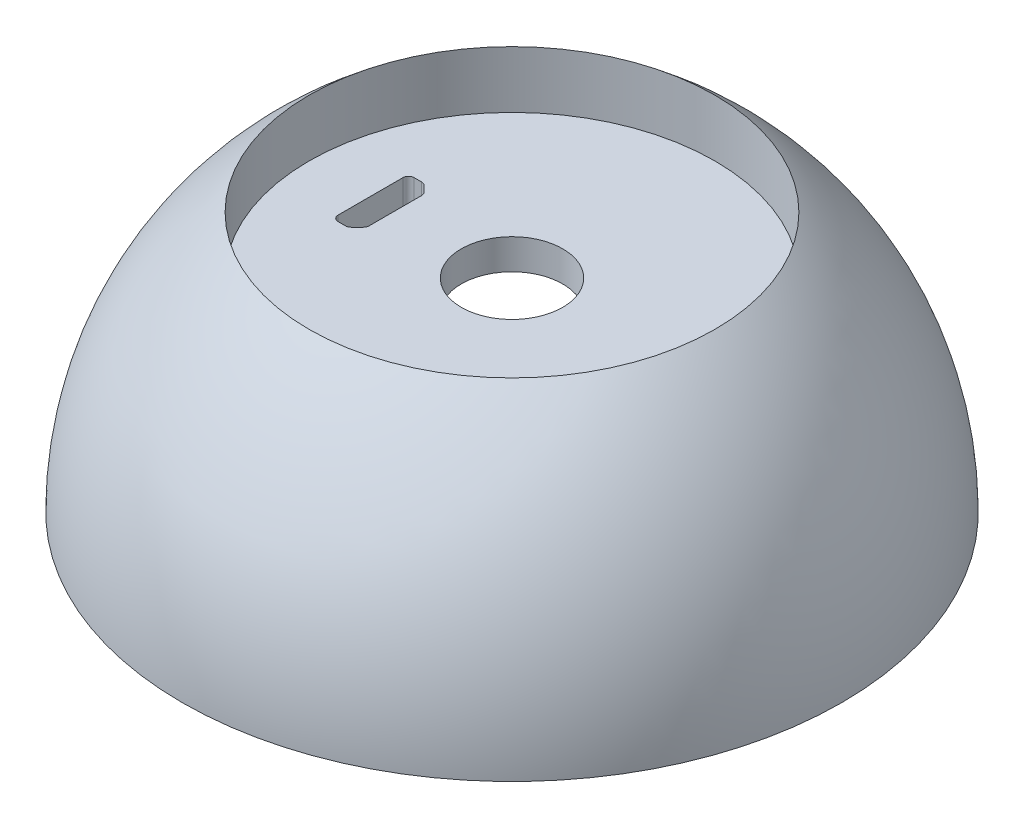
ISO-10303-21;
HEADER;
FILE_DESCRIPTION(('STEP AP214'),'2;1');
FILE_NAME('part.step','',(''),(''),'','','');
FILE_SCHEMA(('AUTOMOTIVE_DESIGN { 1 0 10303 214 1 1 1 1 }'));
ENDSEC;
DATA;
#1=APPLICATION_CONTEXT('core data for automotive mechanical design processes');
#2=APPLICATION_PROTOCOL_DEFINITION('international standard','automotive_design',2000,#1);
#3=PRODUCT_CONTEXT('',#1,'mechanical');
#4=PRODUCT('Part','Part','',(#3));
#5=PRODUCT_RELATED_PRODUCT_CATEGORY('part','',(#4));
#6=PRODUCT_DEFINITION_FORMATION('','',#4);
#7=PRODUCT_DEFINITION_CONTEXT('part definition',#1,'design');
#8=PRODUCT_DEFINITION('design','',#6,#7);
#9=PRODUCT_DEFINITION_SHAPE('','',#8);
#10=(LENGTH_UNIT() NAMED_UNIT(*) SI_UNIT(.MILLI.,.METRE.));
#11=(NAMED_UNIT(*) PLANE_ANGLE_UNIT() SI_UNIT($,.RADIAN.));
#12=(NAMED_UNIT(*) SI_UNIT($,.STERADIAN.) SOLID_ANGLE_UNIT());
#13=UNCERTAINTY_MEASURE_WITH_UNIT(LENGTH_MEASURE(1.E-05),#10,'distance_accuracy_value','');
#14=(GEOMETRIC_REPRESENTATION_CONTEXT(3) GLOBAL_UNCERTAINTY_ASSIGNED_CONTEXT((#13)) GLOBAL_UNIT_ASSIGNED_CONTEXT((#10,
#11,#12)) REPRESENTATION_CONTEXT('',''));
#15=CARTESIAN_POINT('',(0.,0.,0.));
#16=DIRECTION('',(0.,0.,1.));
#17=DIRECTION('',(1.,0.,0.));
#18=AXIS2_PLACEMENT_3D('',#15,#16,#17);
#19=CARTESIAN_POINT('',(-37.5,0.,-32.51));
#20=DIRECTION('',(0.,-1.,0.));
#21=DIRECTION('',(1.,0.,0.));
#22=AXIS2_PLACEMENT_3D('',#19,#20,#21);
#23=PLANE('',#22);
#24=CARTESIAN_POINT('',(0.,0.,0.));
#25=DIRECTION('',(0.,-1.,0.));
#26=DIRECTION('',(1.,0.,0.));
#27=AXIS2_PLACEMENT_3D('',#24,#25,#26);
#28=CIRCLE('',#27,32.5);
#29=CARTESIAN_POINT('',(32.5,0.,0.));
#30=VERTEX_POINT('',#29);
#31=EDGE_CURVE('E290',#30,#30,#28,.T.);
#32=ORIENTED_EDGE('',*,*,#31,.T.);
#33=EDGE_LOOP('',(#32));
#34=FACE_BOUND('',#33,.T.);
#35=CARTESIAN_POINT('',(0.,0.,0.));
#36=DIRECTION('',(0.,-1.,0.));
#37=DIRECTION('',(1.,0.,0.));
#38=AXIS2_PLACEMENT_3D('',#35,#36,#37);
#39=CIRCLE('',#38,29.5);
#40=CARTESIAN_POINT('',(29.5,0.,0.));
#41=VERTEX_POINT('',#40);
#42=EDGE_CURVE('E284',#41,#41,#39,.T.);
#43=ORIENTED_EDGE('',*,*,#42,.F.);
#44=EDGE_LOOP('',(#43));
#45=FACE_BOUND('',#44,.T.);
#46=ADVANCED_FACE('F42',(#34,#45),#23,.T.);
#47=CARTESIAN_POINT('',(0.,17.,0.));
#48=DIRECTION('',(0.,1.,0.));
#49=DIRECTION('',(0.,0.,1.));
#50=AXIS2_PLACEMENT_3D('',#47,#48,#49);
#51=PLANE('',#50);
#52=DIRECTION('',(0.,0.,1.));
#53=VECTOR('',#52,1.);
#54=CARTESIAN_POINT('',(-13.95,17.,1.28559272602469E-13));
#55=LINE('',#54,#53);
#56=CARTESIAN_POINT('',(-13.9500000000001,17.,-3.20036161037357));
#57=VERTEX_POINT('',#56);
#58=CARTESIAN_POINT('',(-13.95,17.,3.19963838962643));
#59=VERTEX_POINT('',#58);
#60=EDGE_CURVE('E264',#57,#59,#55,.T.);
#61=ORIENTED_EDGE('',*,*,#60,.T.);
#62=CARTESIAN_POINT('',(-13.4,17.,3.19963838962643));
#63=DIRECTION('',(0.,1.,0.));
#64=DIRECTION('',(0.,0.,1.));
#65=AXIS2_PLACEMENT_3D('',#62,#63,#64);
#66=CIRCLE('',#65,0.550000000000007);
#67=CARTESIAN_POINT('',(-13.4,17.,3.74963838962643));
#68=VERTEX_POINT('',#67);
#69=EDGE_CURVE('E268',#59,#68,#66,.T.);
#70=ORIENTED_EDGE('',*,*,#69,.T.);
#71=DIRECTION('',(1.,0.,0.));
#72=VECTOR('',#71,1.);
#73=CARTESIAN_POINT('',(0.,17.,3.74963838962643));
#74=LINE('',#73,#72);
#75=CARTESIAN_POINT('',(-12.6535533905933,17.,3.74963838962643));
#76=VERTEX_POINT('',#75);
#77=EDGE_CURVE('E199',#68,#76,#74,.T.);
#78=ORIENTED_EDGE('',*,*,#77,.T.);
#79=CARTESIAN_POINT('',(-12.6535533905933,17.,3.19963838962547));
#80=DIRECTION('',(0.,1.,0.));
#81=DIRECTION('',(0.,0.,1.));
#82=AXIS2_PLACEMENT_3D('',#79,#80,#81);
#83=CIRCLE('',#82,0.550000000000963);
#84=CARTESIAN_POINT('',(-12.2646446609407,17.,3.58854711927943));
#85=VERTEX_POINT('',#84);
#86=EDGE_CURVE('E140',#76,#85,#83,.T.);
#87=ORIENTED_EDGE('',*,*,#86,.T.);
#88=DIRECTION('',(0.707106781186548,0.,-0.707106781186548));
#89=VECTOR('',#88,1.);
#90=CARTESIAN_POINT('',(-4.33804877083063,17.,-4.33804877083063));
#91=LINE('',#90,#89);
#92=CARTESIAN_POINT('',(-11.6610912703473,17.,2.98499372868608));
#93=VERTEX_POINT('',#92);
#94=EDGE_CURVE('E232',#85,#93,#91,.T.);
#95=ORIENTED_EDGE('',*,*,#94,.T.);
#96=CARTESIAN_POINT('',(-12.0500000000002,17.,2.59608499903343));
#97=DIRECTION('',(0.,1.,0.));
#98=DIRECTION('',(0.,0.,1.));
#99=AXIS2_PLACEMENT_3D('',#96,#97,#98);
#100=CIRCLE('',#99,0.550000000000234);
#101=CARTESIAN_POINT('',(-11.5,17.,2.59608499903343));
#102=VERTEX_POINT('',#101);
#103=EDGE_CURVE('E236',#93,#102,#100,.T.);
#104=ORIENTED_EDGE('',*,*,#103,.T.);
#105=DIRECTION('',(0.,0.,-1.));
#106=VECTOR('',#105,1.);
#107=CARTESIAN_POINT('',(-11.5,17.,0.));
#108=LINE('',#107,#106);
#109=CARTESIAN_POINT('',(-11.5,17.,-2.59680821977997));
#110=VERTEX_POINT('',#109);
#111=EDGE_CURVE('E240',#102,#110,#108,.T.);
#112=ORIENTED_EDGE('',*,*,#111,.T.);
#113=CARTESIAN_POINT('',(-12.0499999999986,17.,-2.59680821978093));
#114=DIRECTION('',(0.,1.,0.));
#115=DIRECTION('',(0.,0.,1.));
#116=AXIS2_PLACEMENT_3D('',#113,#114,#115);
#117=CIRCLE('',#116,0.549999999998642);
#118=CARTESIAN_POINT('',(-11.661091270347,17.,-2.98571694943257));
#119=VERTEX_POINT('',#118);
#120=EDGE_CURVE('E244',#110,#119,#117,.T.);
#121=ORIENTED_EDGE('',*,*,#120,.T.);
#122=DIRECTION('',(-0.707106781186547,0.,-0.707106781186548));
#123=VECTOR('',#122,1.);
#124=CARTESIAN_POINT('',(-4.33768716045722,17.,4.33768716045722));
#125=LINE('',#124,#123);
#126=CARTESIAN_POINT('',(-12.2646446609406,17.,-3.58927034002617));
#127=VERTEX_POINT('',#126);
#128=EDGE_CURVE('E248',#119,#127,#125,.T.);
#129=ORIENTED_EDGE('',*,*,#128,.T.);
#130=CARTESIAN_POINT('',(-12.6535533905932,17.,-3.20036161037357));
#131=DIRECTION('',(0.,1.,0.));
#132=DIRECTION('',(0.,0.,1.));
#133=AXIS2_PLACEMENT_3D('',#130,#131,#132);
#134=CIRCLE('',#133,0.549999999999999);
#135=CARTESIAN_POINT('',(-12.6535533905932,17.,-3.75036161037357));
#136=VERTEX_POINT('',#135);
#137=EDGE_CURVE('E252',#127,#136,#134,.T.);
#138=ORIENTED_EDGE('',*,*,#137,.T.);
#139=DIRECTION('',(-1.,0.,0.));
#140=VECTOR('',#139,1.);
#141=CARTESIAN_POINT('',(1.45988774195049E-13,17.,-3.75036161037308));
#142=LINE('',#141,#140);
#143=CARTESIAN_POINT('',(-13.4,17.,-3.7503616103736));
#144=VERTEX_POINT('',#143);
#145=EDGE_CURVE('E256',#136,#144,#142,.T.);
#146=ORIENTED_EDGE('',*,*,#145,.T.);
#147=CARTESIAN_POINT('',(-13.4000000000001,17.,-3.20036161037357));
#148=DIRECTION('',(0.,1.,0.));
#149=DIRECTION('',(0.,0.,1.));
#150=AXIS2_PLACEMENT_3D('',#147,#148,#149);
#151=CIRCLE('',#150,0.549999999999957);
#152=EDGE_CURVE('E260',#144,#57,#151,.T.);
#153=ORIENTED_EDGE('',*,*,#152,.T.);
#154=EDGE_LOOP('',(#61,#70,#78,#87,#95,#104,#112,#121,#129,#138,#146,#153));
#155=FACE_BOUND('',#154,.T.);
#156=CARTESIAN_POINT('',(0.,17.,0.));
#157=DIRECTION('',(0.,1.,0.));
#158=DIRECTION('',(0.,0.,1.));
#159=AXIS2_PLACEMENT_3D('',#156,#157,#158);
#160=CIRCLE('',#159,5.);
#161=CARTESIAN_POINT('',(0.,17.,5.));
#162=VERTEX_POINT('',#161);
#163=EDGE_CURVE('E46',#162,#162,#160,.T.);
#164=ORIENTED_EDGE('',*,*,#163,.T.);
#165=EDGE_LOOP('',(#164));
#166=FACE_BOUND('',#165,.T.);
#167=CARTESIAN_POINT('',(0.,17.,0.));
#168=DIRECTION('',(0.,1.,0.));
#169=DIRECTION('',(0.,0.,1.));
#170=AXIS2_PLACEMENT_3D('',#167,#168,#169);
#171=CIRCLE('',#170,23.);
#172=CARTESIAN_POINT('',(0.,17.,23.));
#173=VERTEX_POINT('',#172);
#174=EDGE_CURVE('E280',#173,#173,#171,.T.);
#175=ORIENTED_EDGE('',*,*,#174,.F.);
#176=EDGE_LOOP('',(#175));
#177=FACE_BOUND('',#176,.T.);
#178=ADVANCED_FACE('F299',(#155,#166,#177),#51,.F.);
#179=CARTESIAN_POINT('',(0.,20.,0.));
#180=DIRECTION('',(0.,1.,0.));
#181=DIRECTION('',(0.,0.,1.));
#182=AXIS2_PLACEMENT_3D('',#179,#180,#181);
#183=CYLINDRICAL_SURFACE('',#182,23.);
#184=ORIENTED_EDGE('',*,*,#174,.T.);
#185=EDGE_LOOP('',(#184));
#186=FACE_BOUND('',#185,.T.);
#187=CARTESIAN_POINT('',(0.,18.4729532019112,0.));
#188=DIRECTION('',(0.,-1.,0.));
#189=DIRECTION('',(0.,0.,-1.));
#190=AXIS2_PLACEMENT_3D('',#187,#188,#189);
#191=CIRCLE('',#190,23.);
#192=CARTESIAN_POINT('',(0.,18.4729532019112,-23.));
#193=VERTEX_POINT('',#192);
#194=EDGE_CURVE('E276',#193,#193,#191,.T.);
#195=ORIENTED_EDGE('',*,*,#194,.T.);
#196=EDGE_LOOP('',(#195));
#197=FACE_BOUND('',#196,.T.);
#198=ADVANCED_FACE('F321',(#186,#197),#183,.T.);
#199=CARTESIAN_POINT('',(0.,0.,0.));
#200=DIRECTION('',(0.,-1.,0.));
#201=DIRECTION('',(1.,0.,0.));
#202=AXIS2_PLACEMENT_3D('',#199,#200,#201);
#203=SPHERICAL_SURFACE('',#202,29.5);
#204=ORIENTED_EDGE('',*,*,#194,.F.);
#205=EDGE_LOOP('',(#204));
#206=FACE_BOUND('',#205,.T.);
#207=ORIENTED_EDGE('',*,*,#42,.T.);
#208=EDGE_LOOP('',(#207));
#209=FACE_BOUND('',#208,.T.);
#210=ADVANCED_FACE('F326',(#206,#209),#203,.F.);
#211=CARTESIAN_POINT('',(0.,0.,0.));
#212=DIRECTION('',(0.,-1.,0.));
#213=DIRECTION('',(1.,0.,0.));
#214=AXIS2_PLACEMENT_3D('',#211,#212,#213);
#215=SPHERICAL_SURFACE('',#214,32.5);
#216=CARTESIAN_POINT('',(0.,25.617376914899,0.));
#217=DIRECTION('',(0.,-1.,0.));
#218=DIRECTION('',(0.,0.,-1.));
#219=AXIS2_PLACEMENT_3D('',#216,#217,#218);
#220=CIRCLE('',#219,20.);
#221=CARTESIAN_POINT('',(0.,25.617376914899,-20.));
#222=VERTEX_POINT('',#221);
#223=EDGE_CURVE('E52',#222,#222,#220,.T.);
#224=ORIENTED_EDGE('',*,*,#223,.T.);
#225=EDGE_LOOP('',(#224));
#226=FACE_BOUND('',#225,.T.);
#227=ORIENTED_EDGE('',*,*,#31,.F.);
#228=EDGE_LOOP('',(#227));
#229=FACE_BOUND('',#228,.T.);
#230=ADVANCED_FACE('F44',(#226,#229),#215,.T.);
#231=CARTESIAN_POINT('',(0.,20.,0.));
#232=DIRECTION('',(0.,1.,0.));
#233=DIRECTION('',(0.,0.,1.));
#234=AXIS2_PLACEMENT_3D('',#231,#232,#233);
#235=CYLINDRICAL_SURFACE('',#234,20.);
#236=CARTESIAN_POINT('',(0.,20.,0.));
#237=DIRECTION('',(0.,1.,0.));
#238=DIRECTION('',(0.,0.,1.));
#239=AXIS2_PLACEMENT_3D('',#236,#237,#238);
#240=CIRCLE('',#239,20.);
#241=CARTESIAN_POINT('',(0.,20.,20.));
#242=VERTEX_POINT('',#241);
#243=EDGE_CURVE('E11',#242,#242,#240,.T.);
#244=ORIENTED_EDGE('',*,*,#243,.F.);
#245=EDGE_LOOP('',(#244));
#246=FACE_BOUND('',#245,.T.);
#247=ORIENTED_EDGE('',*,*,#223,.F.);
#248=EDGE_LOOP('',(#247));
#249=FACE_BOUND('',#248,.T.);
#250=ADVANCED_FACE('F314',(#246,#249),#235,.F.);
#251=CARTESIAN_POINT('',(0.,20.,0.));
#252=DIRECTION('',(0.,1.,0.));
#253=DIRECTION('',(0.,0.,1.));
#254=AXIS2_PLACEMENT_3D('',#251,#252,#253);
#255=PLANE('',#254);
#256=CARTESIAN_POINT('',(-13.4,20.,3.19963838962643));
#257=DIRECTION('',(0.,1.,0.));
#258=DIRECTION('',(0.,0.,1.));
#259=AXIS2_PLACEMENT_3D('',#256,#257,#258);
#260=CIRCLE('',#259,0.550000000000007);
#261=CARTESIAN_POINT('',(-13.95,20.,3.19963838962643));
#262=VERTEX_POINT('',#261);
#263=CARTESIAN_POINT('',(-13.4,20.,3.74963838962643));
#264=VERTEX_POINT('',#263);
#265=EDGE_CURVE('E68',#262,#264,#260,.T.);
#266=ORIENTED_EDGE('',*,*,#265,.F.);
#267=DIRECTION('',(0.,0.,1.));
#268=VECTOR('',#267,1.);
#269=CARTESIAN_POINT('',(-13.9500000000001,20.,-3.20036161037357));
#270=LINE('',#269,#268);
#271=CARTESIAN_POINT('',(-13.9500000000001,20.,-3.20036161037357));
#272=VERTEX_POINT('',#271);
#273=EDGE_CURVE('E190',#272,#262,#270,.T.);
#274=ORIENTED_EDGE('',*,*,#273,.F.);
#275=CARTESIAN_POINT('',(-13.4000000000001,20.,-3.20036161037357));
#276=DIRECTION('',(0.,1.,0.));
#277=DIRECTION('',(0.,0.,1.));
#278=AXIS2_PLACEMENT_3D('',#275,#276,#277);
#279=CIRCLE('',#278,0.549999999999957);
#280=CARTESIAN_POINT('',(-13.4,20.,-3.7503616103736));
#281=VERTEX_POINT('',#280);
#282=EDGE_CURVE('E186',#281,#272,#279,.T.);
#283=ORIENTED_EDGE('',*,*,#282,.F.);
#284=DIRECTION('',(-1.,0.,0.));
#285=VECTOR('',#284,1.);
#286=CARTESIAN_POINT('',(-12.6535533905932,20.,-3.75036161037357));
#287=LINE('',#286,#285);
#288=CARTESIAN_POINT('',(-12.6535533905932,20.,-3.75036161037357));
#289=VERTEX_POINT('',#288);
#290=EDGE_CURVE('E182',#289,#281,#287,.T.);
#291=ORIENTED_EDGE('',*,*,#290,.F.);
#292=CARTESIAN_POINT('',(-12.6535533905932,20.,-3.20036161037357));
#293=DIRECTION('',(0.,1.,0.));
#294=DIRECTION('',(0.,0.,1.));
#295=AXIS2_PLACEMENT_3D('',#292,#293,#294);
#296=CIRCLE('',#295,0.549999999999999);
#297=CARTESIAN_POINT('',(-12.2646446609406,20.,-3.58927034002617));
#298=VERTEX_POINT('',#297);
#299=EDGE_CURVE('E178',#298,#289,#296,.T.);
#300=ORIENTED_EDGE('',*,*,#299,.F.);
#301=DIRECTION('',(-0.707106781186547,0.,-0.707106781186548));
#302=VECTOR('',#301,1.);
#303=CARTESIAN_POINT('',(-11.661091270347,20.,-2.98571694943257));
#304=LINE('',#303,#302);
#305=CARTESIAN_POINT('',(-11.661091270347,20.,-2.98571694943257));
#306=VERTEX_POINT('',#305);
#307=EDGE_CURVE('E174',#306,#298,#304,.T.);
#308=ORIENTED_EDGE('',*,*,#307,.F.);
#309=CARTESIAN_POINT('',(-12.0499999999986,20.,-2.59680821978093));
#310=DIRECTION('',(0.,1.,0.));
#311=DIRECTION('',(0.,0.,1.));
#312=AXIS2_PLACEMENT_3D('',#309,#310,#311);
#313=CIRCLE('',#312,0.549999999998642);
#314=CARTESIAN_POINT('',(-11.5,20.,-2.59680821977997));
#315=VERTEX_POINT('',#314);
#316=EDGE_CURVE('E170',#315,#306,#313,.T.);
#317=ORIENTED_EDGE('',*,*,#316,.F.);
#318=DIRECTION('',(0.,0.,-1.));
#319=VECTOR('',#318,1.);
#320=CARTESIAN_POINT('',(-11.5,20.,-2.50036161037357));
#321=LINE('',#320,#319);
#322=CARTESIAN_POINT('',(-11.5,20.,2.59608499903343));
#323=VERTEX_POINT('',#322);
#324=EDGE_CURVE('E166',#323,#315,#321,.T.);
#325=ORIENTED_EDGE('',*,*,#324,.F.);
#326=CARTESIAN_POINT('',(-12.0500000000002,20.,2.59608499903343));
#327=DIRECTION('',(0.,1.,0.));
#328=DIRECTION('',(0.,0.,1.));
#329=AXIS2_PLACEMENT_3D('',#326,#327,#328);
#330=CIRCLE('',#329,0.550000000000234);
#331=CARTESIAN_POINT('',(-11.6610912703473,20.,2.98499372868608));
#332=VERTEX_POINT('',#331);
#333=EDGE_CURVE('E160',#332,#323,#330,.T.);
#334=ORIENTED_EDGE('',*,*,#333,.F.);
#335=DIRECTION('',(0.707106781186548,0.,-0.707106781186548));
#336=VECTOR('',#335,1.);
#337=CARTESIAN_POINT('',(-12.2646446609407,20.,3.58854711927943));
#338=LINE('',#337,#336);
#339=CARTESIAN_POINT('',(-12.2646446609407,20.,3.58854711927943));
#340=VERTEX_POINT('',#339);
#341=EDGE_CURVE('E156',#340,#332,#338,.T.);
#342=ORIENTED_EDGE('',*,*,#341,.F.);
#343=CARTESIAN_POINT('',(-12.6535533905933,20.,3.19963838962547));
#344=DIRECTION('',(0.,1.,0.));
#345=DIRECTION('',(0.,0.,1.));
#346=AXIS2_PLACEMENT_3D('',#343,#344,#345);
#347=CIRCLE('',#346,0.550000000000963);
#348=CARTESIAN_POINT('',(-12.6535533905933,20.,3.74963838962643));
#349=VERTEX_POINT('',#348);
#350=EDGE_CURVE('E137',#349,#340,#347,.T.);
#351=ORIENTED_EDGE('',*,*,#350,.F.);
#352=DIRECTION('',(1.,0.,0.));
#353=VECTOR('',#352,1.);
#354=CARTESIAN_POINT('',(-13.4,20.,3.74963838962643));
#355=LINE('',#354,#353);
#356=EDGE_CURVE('E147',#264,#349,#355,.T.);
#357=ORIENTED_EDGE('',*,*,#356,.F.);
#358=EDGE_LOOP('',(#266,#274,#283,#291,#300,#308,#317,#325,#334,#342,#351,#357));
#359=FACE_BOUND('',#358,.T.);
#360=CARTESIAN_POINT('',(0.,20.,0.));
#361=DIRECTION('',(0.,1.,0.));
#362=DIRECTION('',(0.,0.,1.));
#363=AXIS2_PLACEMENT_3D('',#360,#361,#362);
#364=CIRCLE('',#363,5.);
#365=CARTESIAN_POINT('',(0.,20.,5.));
#366=VERTEX_POINT('',#365);
#367=EDGE_CURVE('E272',#366,#366,#364,.T.);
#368=ORIENTED_EDGE('',*,*,#367,.F.);
#369=EDGE_LOOP('',(#368));
#370=FACE_BOUND('',#369,.T.);
#371=ORIENTED_EDGE('',*,*,#243,.T.);
#372=EDGE_LOOP('',(#371));
#373=FACE_BOUND('',#372,.T.);
#374=ADVANCED_FACE('F152',(#359,#370,#373),#255,.T.);
#375=CARTESIAN_POINT('',(0.,7.5,0.));
#376=DIRECTION('',(0.,1.,0.));
#377=DIRECTION('',(0.,0.,1.));
#378=AXIS2_PLACEMENT_3D('',#375,#376,#377);
#379=CYLINDRICAL_SURFACE('',#378,5.);
#380=ORIENTED_EDGE('',*,*,#367,.T.);
#381=EDGE_LOOP('',(#380));
#382=FACE_BOUND('',#381,.T.);
#383=ORIENTED_EDGE('',*,*,#163,.F.);
#384=EDGE_LOOP('',(#383));
#385=FACE_BOUND('',#384,.T.);
#386=ADVANCED_FACE('F302',(#382,#385),#379,.F.);
#387=CARTESIAN_POINT('',(-13.4,10.,3.19963838962643));
#388=DIRECTION('',(0.,1.,0.));
#389=DIRECTION('',(0.,0.,1.));
#390=AXIS2_PLACEMENT_3D('',#387,#388,#389);
#391=CYLINDRICAL_SURFACE('',#390,0.550000000000007);
#392=DIRECTION('',(0.,1.,0.));
#393=VECTOR('',#392,1.);
#394=CARTESIAN_POINT('',(-13.95,10.,3.19963838962643));
#395=LINE('',#394,#393);
#396=EDGE_CURVE('E196',#59,#262,#395,.T.);
#397=ORIENTED_EDGE('',*,*,#396,.T.);
#398=ORIENTED_EDGE('',*,*,#265,.T.);
#399=DIRECTION('',(0.,1.,0.));
#400=VECTOR('',#399,1.);
#401=CARTESIAN_POINT('',(-13.4,10.,3.74963838962643));
#402=LINE('',#401,#400);
#403=EDGE_CURVE('E144',#68,#264,#402,.T.);
#404=ORIENTED_EDGE('',*,*,#403,.F.);
#405=ORIENTED_EDGE('',*,*,#69,.F.);
#406=EDGE_LOOP('',(#397,#398,#404,#405));
#407=FACE_BOUND('',#406,.T.);
#408=ADVANCED_FACE('F304',(#407),#391,.F.);
#409=CARTESIAN_POINT('',(-13.9500000000001,10.,-3.20036161037357));
#410=DIRECTION('',(-1.,0.,0.));
#411=DIRECTION('',(0.,0.,1.));
#412=AXIS2_PLACEMENT_3D('',#409,#410,#411);
#413=PLANE('',#412);
#414=DIRECTION('',(0.,1.,0.));
#415=VECTOR('',#414,1.);
#416=CARTESIAN_POINT('',(-13.9500000000001,10.,-3.20036161037357));
#417=LINE('',#416,#415);
#418=EDGE_CURVE('E200',#57,#272,#417,.T.);
#419=ORIENTED_EDGE('',*,*,#418,.T.);
#420=ORIENTED_EDGE('',*,*,#273,.T.);
#421=ORIENTED_EDGE('',*,*,#396,.F.);
#422=ORIENTED_EDGE('',*,*,#60,.F.);
#423=EDGE_LOOP('',(#419,#420,#421,#422));
#424=FACE_BOUND('',#423,.T.);
#425=ADVANCED_FACE('F311',(#424),#413,.F.);
#426=CARTESIAN_POINT('',(-13.4000000000001,10.,-3.20036161037357));
#427=DIRECTION('',(0.,1.,0.));
#428=DIRECTION('',(0.,0.,1.));
#429=AXIS2_PLACEMENT_3D('',#426,#427,#428);
#430=CYLINDRICAL_SURFACE('',#429,0.549999999999957);
#431=DIRECTION('',(0.,1.,0.));
#432=VECTOR('',#431,1.);
#433=CARTESIAN_POINT('',(-13.4,10.,-3.7503616103736));
#434=LINE('',#433,#432);
#435=EDGE_CURVE('E203',#144,#281,#434,.T.);
#436=ORIENTED_EDGE('',*,*,#435,.T.);
#437=ORIENTED_EDGE('',*,*,#282,.T.);
#438=ORIENTED_EDGE('',*,*,#418,.F.);
#439=ORIENTED_EDGE('',*,*,#152,.F.);
#440=EDGE_LOOP('',(#436,#437,#438,#439));
#441=FACE_BOUND('',#440,.T.);
#442=ADVANCED_FACE('F372',(#441),#430,.F.);
#443=CARTESIAN_POINT('',(-12.6535533905932,10.,-3.75036161037357));
#444=DIRECTION('',(0.,0.,-1.));
#445=DIRECTION('',(-1.,0.,0.));
#446=AXIS2_PLACEMENT_3D('',#443,#444,#445);
#447=PLANE('',#446);
#448=DIRECTION('',(0.,1.,0.));
#449=VECTOR('',#448,1.);
#450=CARTESIAN_POINT('',(-12.6535533905932,10.,-3.75036161037357));
#451=LINE('',#450,#449);
#452=EDGE_CURVE('E206',#136,#289,#451,.T.);
#453=ORIENTED_EDGE('',*,*,#452,.T.);
#454=ORIENTED_EDGE('',*,*,#290,.T.);
#455=ORIENTED_EDGE('',*,*,#435,.F.);
#456=ORIENTED_EDGE('',*,*,#145,.F.);
#457=EDGE_LOOP('',(#453,#454,#455,#456));
#458=FACE_BOUND('',#457,.T.);
#459=ADVANCED_FACE('F383',(#458),#447,.F.);
#460=CARTESIAN_POINT('',(-12.6535533905932,10.,-3.20036161037357));
#461=DIRECTION('',(0.,1.,0.));
#462=DIRECTION('',(0.,0.,1.));
#463=AXIS2_PLACEMENT_3D('',#460,#461,#462);
#464=CYLINDRICAL_SURFACE('',#463,0.549999999999999);
#465=DIRECTION('',(0.,1.,0.));
#466=VECTOR('',#465,1.);
#467=CARTESIAN_POINT('',(-12.2646446609406,10.,-3.58927034002617));
#468=LINE('',#467,#466);
#469=EDGE_CURVE('E209',#127,#298,#468,.T.);
#470=ORIENTED_EDGE('',*,*,#469,.T.);
#471=ORIENTED_EDGE('',*,*,#299,.T.);
#472=ORIENTED_EDGE('',*,*,#452,.F.);
#473=ORIENTED_EDGE('',*,*,#137,.F.);
#474=EDGE_LOOP('',(#470,#471,#472,#473));
#475=FACE_BOUND('',#474,.T.);
#476=ADVANCED_FACE('F393',(#475),#464,.F.);
#477=CARTESIAN_POINT('',(-11.661091270347,10.,-2.98571694943257));
#478=DIRECTION('',(0.707106781186548,0.,-0.707106781186547));
#479=DIRECTION('',(-0.707106781186547,0.,-0.707106781186548));
#480=AXIS2_PLACEMENT_3D('',#477,#478,#479);
#481=PLANE('',#480);
#482=DIRECTION('',(0.,1.,0.));
#483=VECTOR('',#482,1.);
#484=CARTESIAN_POINT('',(-11.661091270347,10.,-2.98571694943257));
#485=LINE('',#484,#483);
#486=EDGE_CURVE('E212',#119,#306,#485,.T.);
#487=ORIENTED_EDGE('',*,*,#486,.T.);
#488=ORIENTED_EDGE('',*,*,#307,.T.);
#489=ORIENTED_EDGE('',*,*,#469,.F.);
#490=ORIENTED_EDGE('',*,*,#128,.F.);
#491=EDGE_LOOP('',(#487,#488,#489,#490));
#492=FACE_BOUND('',#491,.T.);
#493=ADVANCED_FACE('F403',(#492),#481,.F.);
#494=CARTESIAN_POINT('',(-12.0499999999986,10.,-2.59680821978093));
#495=DIRECTION('',(0.,1.,0.));
#496=DIRECTION('',(0.,0.,1.));
#497=AXIS2_PLACEMENT_3D('',#494,#495,#496);
#498=CYLINDRICAL_SURFACE('',#497,0.549999999998642);
#499=DIRECTION('',(0.,1.,0.));
#500=VECTOR('',#499,1.);
#501=CARTESIAN_POINT('',(-11.5,10.,-2.59680821977997));
#502=LINE('',#501,#500);
#503=EDGE_CURVE('E215',#110,#315,#502,.T.);
#504=ORIENTED_EDGE('',*,*,#503,.T.);
#505=ORIENTED_EDGE('',*,*,#316,.T.);
#506=ORIENTED_EDGE('',*,*,#486,.F.);
#507=ORIENTED_EDGE('',*,*,#120,.F.);
#508=EDGE_LOOP('',(#504,#505,#506,#507));
#509=FACE_BOUND('',#508,.T.);
#510=ADVANCED_FACE('F413',(#509),#498,.F.);
#511=CARTESIAN_POINT('',(-11.5,10.,-2.50036161037357));
#512=DIRECTION('',(1.,0.,0.));
#513=DIRECTION('',(0.,0.,-1.));
#514=AXIS2_PLACEMENT_3D('',#511,#512,#513);
#515=PLANE('',#514);
#516=DIRECTION('',(0.,1.,0.));
#517=VECTOR('',#516,1.);
#518=CARTESIAN_POINT('',(-11.5,10.,2.59608499903343));
#519=LINE('',#518,#517);
#520=EDGE_CURVE('E218',#102,#323,#519,.T.);
#521=ORIENTED_EDGE('',*,*,#520,.T.);
#522=ORIENTED_EDGE('',*,*,#324,.T.);
#523=ORIENTED_EDGE('',*,*,#503,.F.);
#524=ORIENTED_EDGE('',*,*,#111,.F.);
#525=EDGE_LOOP('',(#521,#522,#523,#524));
#526=FACE_BOUND('',#525,.T.);
#527=ADVANCED_FACE('F423',(#526),#515,.F.);
#528=CARTESIAN_POINT('',(-12.0500000000002,10.,2.59608499903343));
#529=DIRECTION('',(0.,1.,0.));
#530=DIRECTION('',(0.,0.,1.));
#531=AXIS2_PLACEMENT_3D('',#528,#529,#530);
#532=CYLINDRICAL_SURFACE('',#531,0.550000000000234);
#533=DIRECTION('',(0.,1.,0.));
#534=VECTOR('',#533,1.);
#535=CARTESIAN_POINT('',(-11.6610912703473,10.,2.98499372868608));
#536=LINE('',#535,#534);
#537=EDGE_CURVE('E221',#93,#332,#536,.T.);
#538=ORIENTED_EDGE('',*,*,#537,.T.);
#539=ORIENTED_EDGE('',*,*,#333,.T.);
#540=ORIENTED_EDGE('',*,*,#520,.F.);
#541=ORIENTED_EDGE('',*,*,#103,.F.);
#542=EDGE_LOOP('',(#538,#539,#540,#541));
#543=FACE_BOUND('',#542,.T.);
#544=ADVANCED_FACE('F434',(#543),#532,.F.);
#545=CARTESIAN_POINT('',(-12.2646446609407,10.,3.58854711927943));
#546=DIRECTION('',(0.707106781186548,0.,0.707106781186548));
#547=DIRECTION('',(0.707106781186548,0.,-0.707106781186548));
#548=AXIS2_PLACEMENT_3D('',#545,#546,#547);
#549=PLANE('',#548);
#550=DIRECTION('',(0.,1.,0.));
#551=VECTOR('',#550,1.);
#552=CARTESIAN_POINT('',(-12.2646446609407,10.,3.58854711927943));
#553=LINE('',#552,#551);
#554=EDGE_CURVE('E143',#85,#340,#553,.T.);
#555=ORIENTED_EDGE('',*,*,#554,.T.);
#556=ORIENTED_EDGE('',*,*,#341,.T.);
#557=ORIENTED_EDGE('',*,*,#537,.F.);
#558=ORIENTED_EDGE('',*,*,#94,.F.);
#559=EDGE_LOOP('',(#555,#556,#557,#558));
#560=FACE_BOUND('',#559,.T.);
#561=ADVANCED_FACE('F444',(#560),#549,.F.);
#562=CARTESIAN_POINT('',(-12.6535533905933,10.,3.19963838962547));
#563=DIRECTION('',(0.,1.,0.));
#564=DIRECTION('',(0.,0.,1.));
#565=AXIS2_PLACEMENT_3D('',#562,#563,#564);
#566=CYLINDRICAL_SURFACE('',#565,0.550000000000963);
#567=DIRECTION('',(0.,1.,0.));
#568=VECTOR('',#567,1.);
#569=CARTESIAN_POINT('',(-12.6535533905933,10.,3.74963838962643));
#570=LINE('',#569,#568);
#571=EDGE_CURVE('E60',#76,#349,#570,.T.);
#572=ORIENTED_EDGE('',*,*,#571,.T.);
#573=ORIENTED_EDGE('',*,*,#350,.T.);
#574=ORIENTED_EDGE('',*,*,#554,.F.);
#575=ORIENTED_EDGE('',*,*,#86,.F.);
#576=EDGE_LOOP('',(#572,#573,#574,#575));
#577=FACE_BOUND('',#576,.T.);
#578=ADVANCED_FACE('F134',(#577),#566,.F.);
#579=CARTESIAN_POINT('',(-13.4,10.,3.74963838962643));
#580=DIRECTION('',(0.,0.,1.));
#581=DIRECTION('',(1.,0.,0.));
#582=AXIS2_PLACEMENT_3D('',#579,#580,#581);
#583=PLANE('',#582);
#584=ORIENTED_EDGE('',*,*,#403,.T.);
#585=ORIENTED_EDGE('',*,*,#356,.T.);
#586=ORIENTED_EDGE('',*,*,#571,.F.);
#587=ORIENTED_EDGE('',*,*,#77,.F.);
#588=EDGE_LOOP('',(#584,#585,#586,#587));
#589=FACE_BOUND('',#588,.T.);
#590=ADVANCED_FACE('F148',(#589),#583,.F.);
#591=CLOSED_SHELL('',(#46,#178,#198,#210,#230,#250,#374,#386,#408,#425,#442,#459,#476,#493,#510,
#527,#544,#561,#578,#590));
#592=MANIFOLD_SOLID_BREP('B2',#591);
#593=ADVANCED_BREP_SHAPE_REPRESENTATION('',(#18,#592),#14);
#594=SHAPE_DEFINITION_REPRESENTATION(#9,#593);
ENDSEC;
END-ISO-10303-21;
